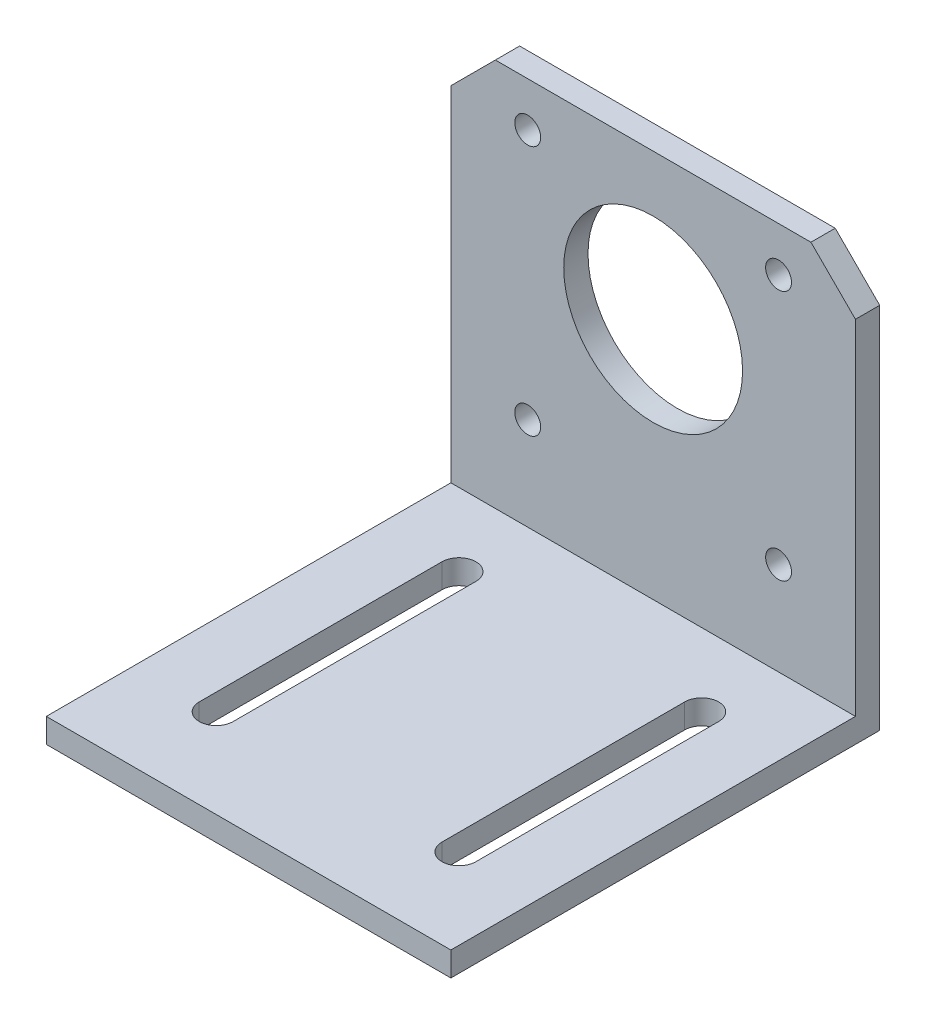
ISO-10303-21;
HEADER;
FILE_DESCRIPTION(('STEP AP214'),'2;1');
FILE_NAME('part.step','',(''),(''),'','','');
FILE_SCHEMA(('AUTOMOTIVE_DESIGN { 1 0 10303 214 1 1 1 1 }'));
ENDSEC;
DATA;
#1=APPLICATION_CONTEXT('core data for automotive mechanical design processes');
#2=APPLICATION_PROTOCOL_DEFINITION('international standard','automotive_design',2000,#1);
#3=PRODUCT_CONTEXT('',#1,'mechanical');
#4=PRODUCT('Part','Part','',(#3));
#5=PRODUCT_RELATED_PRODUCT_CATEGORY('part','',(#4));
#6=PRODUCT_DEFINITION_FORMATION('','',#4);
#7=PRODUCT_DEFINITION_CONTEXT('part definition',#1,'design');
#8=PRODUCT_DEFINITION('design','',#6,#7);
#9=PRODUCT_DEFINITION_SHAPE('','',#8);
#10=(LENGTH_UNIT() NAMED_UNIT(*) SI_UNIT(.MILLI.,.METRE.));
#11=(NAMED_UNIT(*) PLANE_ANGLE_UNIT() SI_UNIT($,.RADIAN.));
#12=(NAMED_UNIT(*) SI_UNIT($,.STERADIAN.) SOLID_ANGLE_UNIT());
#13=UNCERTAINTY_MEASURE_WITH_UNIT(LENGTH_MEASURE(1.E-05),#10,'distance_accuracy_value','');
#14=(GEOMETRIC_REPRESENTATION_CONTEXT(3) GLOBAL_UNCERTAINTY_ASSIGNED_CONTEXT((#13)) GLOBAL_UNIT_ASSIGNED_CONTEXT((#10,
#11,#12)) REPRESENTATION_CONTEXT('',''));
#15=CARTESIAN_POINT('',(0.,0.,0.));
#16=DIRECTION('',(0.,0.,1.));
#17=DIRECTION('',(1.,0.,0.));
#18=AXIS2_PLACEMENT_3D('',#15,#16,#17);
#19=CARTESIAN_POINT('',(50.,0.,0.));
#20=DIRECTION('',(0.,0.,-1.));
#21=DIRECTION('',(-1.,0.,0.));
#22=AXIS2_PLACEMENT_3D('',#19,#20,#21);
#23=PLANE('',#22);
#24=DIRECTION('',(0.,-1.,0.));
#25=VECTOR('',#24,1.);
#26=CARTESIAN_POINT('',(50.,0.,0.));
#27=LINE('',#26,#25);
#28=CARTESIAN_POINT('',(50.,3.,0.));
#29=VERTEX_POINT('',#28);
#30=CARTESIAN_POINT('',(50.,0.,0.));
#31=VERTEX_POINT('',#30);
#32=EDGE_CURVE('E189',#29,#31,#27,.T.);
#33=ORIENTED_EDGE('',*,*,#32,.F.);
#34=DIRECTION('',(-1.,0.,0.));
#35=VECTOR('',#34,1.);
#36=CARTESIAN_POINT('',(50.,3.,0.));
#37=LINE('',#36,#35);
#38=CARTESIAN_POINT('',(0.,3.,0.));
#39=VERTEX_POINT('',#38);
#40=EDGE_CURVE('E182',#29,#39,#37,.T.);
#41=ORIENTED_EDGE('',*,*,#40,.T.);
#42=DIRECTION('',(0.,-1.,0.));
#43=VECTOR('',#42,1.);
#44=CARTESIAN_POINT('',(0.,0.,0.));
#45=LINE('',#44,#43);
#46=CARTESIAN_POINT('',(0.,0.,0.));
#47=VERTEX_POINT('',#46);
#48=EDGE_CURVE('E200',#39,#47,#45,.T.);
#49=ORIENTED_EDGE('',*,*,#48,.T.);
#50=DIRECTION('',(-1.,0.,0.));
#51=VECTOR('',#50,1.);
#52=CARTESIAN_POINT('',(50.,0.,0.));
#53=LINE('',#52,#51);
#54=EDGE_CURVE('E215',#31,#47,#53,.T.);
#55=ORIENTED_EDGE('',*,*,#54,.F.);
#56=EDGE_LOOP('',(#33,#41,#49,#55));
#57=FACE_BOUND('',#56,.T.);
#58=ADVANCED_FACE('F42',(#57),#23,.F.);
#59=CARTESIAN_POINT('',(50.,0.,0.));
#60=DIRECTION('',(0.,1.,0.));
#61=DIRECTION('',(0.,0.,1.));
#62=AXIS2_PLACEMENT_3D('',#59,#60,#61);
#63=PLANE('',#62);
#64=DIRECTION('',(0.,0.,-1.));
#65=VECTOR('',#64,1.);
#66=CARTESIAN_POINT('',(12.1,0.,0.));
#67=LINE('',#66,#65);
#68=CARTESIAN_POINT('',(12.1,0.,-11.));
#69=VERTEX_POINT('',#68);
#70=CARTESIAN_POINT('',(12.1,0.,-41.));
#71=VERTEX_POINT('',#70);
#72=EDGE_CURVE('E316',#69,#71,#67,.T.);
#73=ORIENTED_EDGE('',*,*,#72,.T.);
#74=CARTESIAN_POINT('',(9.99999999999999,0.,-41.));
#75=DIRECTION('',(0.,1.,0.));
#76=DIRECTION('',(0.,0.,1.));
#77=AXIS2_PLACEMENT_3D('',#74,#75,#76);
#78=CIRCLE('',#77,2.1);
#79=CARTESIAN_POINT('',(7.89999999999999,0.,-41.));
#80=VERTEX_POINT('',#79);
#81=EDGE_CURVE('E261',#71,#80,#78,.T.);
#82=ORIENTED_EDGE('',*,*,#81,.T.);
#83=DIRECTION('',(0.,0.,1.));
#84=VECTOR('',#83,1.);
#85=CARTESIAN_POINT('',(7.9,0.,0.));
#86=LINE('',#85,#84);
#87=CARTESIAN_POINT('',(7.9,0.,-11.));
#88=VERTEX_POINT('',#87);
#89=EDGE_CURVE('E308',#80,#88,#86,.T.);
#90=ORIENTED_EDGE('',*,*,#89,.T.);
#91=CARTESIAN_POINT('',(10.,0.,-11.));
#92=DIRECTION('',(0.,1.,0.));
#93=DIRECTION('',(0.,0.,1.));
#94=AXIS2_PLACEMENT_3D('',#91,#92,#93);
#95=CIRCLE('',#94,2.1);
#96=EDGE_CURVE('E312',#88,#69,#95,.T.);
#97=ORIENTED_EDGE('',*,*,#96,.T.);
#98=EDGE_LOOP('',(#73,#82,#90,#97));
#99=FACE_BOUND('',#98,.T.);
#100=DIRECTION('',(0.,0.,-1.));
#101=VECTOR('',#100,1.);
#102=CARTESIAN_POINT('',(42.1,0.,0.));
#103=LINE('',#102,#101);
#104=CARTESIAN_POINT('',(42.1,0.,-11.));
#105=VERTEX_POINT('',#104);
#106=CARTESIAN_POINT('',(42.1,0.,-41.));
#107=VERTEX_POINT('',#106);
#108=EDGE_CURVE('E300',#105,#107,#103,.T.);
#109=ORIENTED_EDGE('',*,*,#108,.T.);
#110=CARTESIAN_POINT('',(40.,0.,-41.));
#111=DIRECTION('',(0.,1.,0.));
#112=DIRECTION('',(0.,0.,1.));
#113=AXIS2_PLACEMENT_3D('',#110,#111,#112);
#114=CIRCLE('',#113,2.1);
#115=CARTESIAN_POINT('',(37.9,0.,-41.));
#116=VERTEX_POINT('',#115);
#117=EDGE_CURVE('E304',#107,#116,#114,.T.);
#118=ORIENTED_EDGE('',*,*,#117,.T.);
#119=DIRECTION('',(0.,0.,1.));
#120=VECTOR('',#119,1.);
#121=CARTESIAN_POINT('',(37.9,0.,0.));
#122=LINE('',#121,#120);
#123=CARTESIAN_POINT('',(37.9,0.,-11.));
#124=VERTEX_POINT('',#123);
#125=EDGE_CURVE('E263',#116,#124,#122,.T.);
#126=ORIENTED_EDGE('',*,*,#125,.T.);
#127=CARTESIAN_POINT('',(40.,0.,-11.));
#128=DIRECTION('',(0.,1.,0.));
#129=DIRECTION('',(0.,0.,1.));
#130=AXIS2_PLACEMENT_3D('',#127,#128,#129);
#131=CIRCLE('',#130,2.1);
#132=EDGE_CURVE('E268',#124,#105,#131,.T.);
#133=ORIENTED_EDGE('',*,*,#132,.T.);
#134=EDGE_LOOP('',(#109,#118,#126,#133));
#135=FACE_BOUND('',#134,.T.);
#136=DIRECTION('',(0.,0.,-1.));
#137=VECTOR('',#136,1.);
#138=CARTESIAN_POINT('',(0.,0.,0.));
#139=LINE('',#138,#137);
#140=CARTESIAN_POINT('',(0.,0.,-53.));
#141=VERTEX_POINT('',#140);
#142=EDGE_CURVE('E203',#47,#141,#139,.T.);
#143=ORIENTED_EDGE('',*,*,#142,.T.);
#144=DIRECTION('',(-1.,0.,0.));
#145=VECTOR('',#144,1.);
#146=CARTESIAN_POINT('',(50.,0.,-53.));
#147=LINE('',#146,#145);
#148=CARTESIAN_POINT('',(50.,0.,-53.));
#149=VERTEX_POINT('',#148);
#150=EDGE_CURVE('E211',#149,#141,#147,.T.);
#151=ORIENTED_EDGE('',*,*,#150,.F.);
#152=DIRECTION('',(0.,0.,-1.));
#153=VECTOR('',#152,1.);
#154=CARTESIAN_POINT('',(50.,0.,0.));
#155=LINE('',#154,#153);
#156=EDGE_CURVE('E192',#31,#149,#155,.T.);
#157=ORIENTED_EDGE('',*,*,#156,.F.);
#158=ORIENTED_EDGE('',*,*,#54,.T.);
#159=EDGE_LOOP('',(#143,#151,#157,#158));
#160=FACE_BOUND('',#159,.T.);
#161=ADVANCED_FACE('F344',(#99,#135,#160),#63,.F.);
#162=CARTESIAN_POINT('',(50.,0.,-53.));
#163=DIRECTION('',(0.,0.,1.));
#164=DIRECTION('',(1.,0.,0.));
#165=AXIS2_PLACEMENT_3D('',#162,#163,#164);
#166=PLANE('',#165);
#167=CARTESIAN_POINT('',(40.5,45.5,-53.));
#168=DIRECTION('',(0.,0.,1.));
#169=DIRECTION('',(1.,0.,0.));
#170=AXIS2_PLACEMENT_3D('',#167,#168,#169);
#171=CIRCLE('',#170,1.6);
#172=CARTESIAN_POINT('',(42.1,45.5,-53.));
#173=VERTEX_POINT('',#172);
#174=EDGE_CURVE('E273',#173,#173,#171,.T.);
#175=ORIENTED_EDGE('',*,*,#174,.T.);
#176=EDGE_LOOP('',(#175));
#177=FACE_BOUND('',#176,.T.);
#178=CARTESIAN_POINT('',(9.5,45.5,-53.));
#179=DIRECTION('',(0.,0.,1.));
#180=DIRECTION('',(1.,0.,0.));
#181=AXIS2_PLACEMENT_3D('',#178,#179,#180);
#182=CIRCLE('',#181,1.6);
#183=CARTESIAN_POINT('',(11.1,45.5,-53.));
#184=VERTEX_POINT('',#183);
#185=EDGE_CURVE('E375',#184,#184,#182,.T.);
#186=ORIENTED_EDGE('',*,*,#185,.T.);
#187=EDGE_LOOP('',(#186));
#188=FACE_BOUND('',#187,.T.);
#189=CARTESIAN_POINT('',(9.5,14.5,-53.));
#190=DIRECTION('',(0.,0.,1.));
#191=DIRECTION('',(1.,0.,0.));
#192=AXIS2_PLACEMENT_3D('',#189,#190,#191);
#193=CIRCLE('',#192,1.6);
#194=CARTESIAN_POINT('',(11.1,14.5,-53.));
#195=VERTEX_POINT('',#194);
#196=EDGE_CURVE('E372',#195,#195,#193,.T.);
#197=ORIENTED_EDGE('',*,*,#196,.T.);
#198=EDGE_LOOP('',(#197));
#199=FACE_BOUND('',#198,.T.);
#200=CARTESIAN_POINT('',(40.5,14.5,-53.));
#201=DIRECTION('',(0.,0.,1.));
#202=DIRECTION('',(1.,0.,0.));
#203=AXIS2_PLACEMENT_3D('',#200,#201,#202);
#204=CIRCLE('',#203,1.6);
#205=CARTESIAN_POINT('',(42.1,14.5,-53.));
#206=VERTEX_POINT('',#205);
#207=EDGE_CURVE('E362',#206,#206,#204,.T.);
#208=ORIENTED_EDGE('',*,*,#207,.T.);
#209=EDGE_LOOP('',(#208));
#210=FACE_BOUND('',#209,.T.);
#211=CARTESIAN_POINT('',(25.,33.,-53.));
#212=DIRECTION('',(0.,0.,1.));
#213=DIRECTION('',(1.,0.,0.));
#214=AXIS2_PLACEMENT_3D('',#211,#212,#213);
#215=CIRCLE('',#214,11.05);
#216=CARTESIAN_POINT('',(36.05,33.,-53.));
#217=VERTEX_POINT('',#216);
#218=EDGE_CURVE('E358',#217,#217,#215,.T.);
#219=ORIENTED_EDGE('',*,*,#218,.T.);
#220=EDGE_LOOP('',(#219));
#221=FACE_BOUND('',#220,.T.);
#222=DIRECTION('',(0.,1.,0.));
#223=VECTOR('',#222,1.);
#224=CARTESIAN_POINT('',(0.,0.,-53.));
#225=LINE('',#224,#223);
#226=CARTESIAN_POINT('',(0.,45.5,-53.));
#227=VERTEX_POINT('',#226);
#228=EDGE_CURVE('E193',#141,#227,#225,.T.);
#229=ORIENTED_EDGE('',*,*,#228,.T.);
#230=DIRECTION('',(0.707106781186548,0.707106781186547,0.));
#231=VECTOR('',#230,1.);
#232=CARTESIAN_POINT('',(2.25000000000002,47.75,-53.));
#233=LINE('',#232,#231);
#234=CARTESIAN_POINT('',(5.5,51.,-53.));
#235=VERTEX_POINT('',#234);
#236=EDGE_CURVE('E354',#227,#235,#233,.T.);
#237=ORIENTED_EDGE('',*,*,#236,.T.);
#238=DIRECTION('',(-1.,0.,0.));
#239=VECTOR('',#238,1.);
#240=CARTESIAN_POINT('',(50.,51.,-53.));
#241=LINE('',#240,#239);
#242=CARTESIAN_POINT('',(44.5,51.,-53.));
#243=VERTEX_POINT('',#242);
#244=EDGE_CURVE('E169',#243,#235,#241,.T.);
#245=ORIENTED_EDGE('',*,*,#244,.F.);
#246=DIRECTION('',(0.707106781186548,-0.707106781186548,0.));
#247=VECTOR('',#246,1.);
#248=CARTESIAN_POINT('',(72.75,22.75,-53.));
#249=LINE('',#248,#247);
#250=CARTESIAN_POINT('',(50.,45.5,-53.));
#251=VERTEX_POINT('',#250);
#252=EDGE_CURVE('E356',#243,#251,#249,.T.);
#253=ORIENTED_EDGE('',*,*,#252,.T.);
#254=DIRECTION('',(0.,1.,0.));
#255=VECTOR('',#254,1.);
#256=CARTESIAN_POINT('',(50.,0.,-53.));
#257=LINE('',#256,#255);
#258=EDGE_CURVE('E196',#149,#251,#257,.T.);
#259=ORIENTED_EDGE('',*,*,#258,.F.);
#260=ORIENTED_EDGE('',*,*,#150,.T.);
#261=EDGE_LOOP('',(#229,#237,#245,#253,#259,#260));
#262=FACE_BOUND('',#261,.T.);
#263=ADVANCED_FACE('F353',(#177,#188,#199,#210,#221,#262),#166,.F.);
#264=CARTESIAN_POINT('',(50.,51.,0.));
#265=DIRECTION('',(0.,-1.,0.));
#266=DIRECTION('',(0.,0.,-1.));
#267=AXIS2_PLACEMENT_3D('',#264,#265,#266);
#268=PLANE('',#267);
#269=ORIENTED_EDGE('',*,*,#244,.T.);
#270=DIRECTION('',(0.,0.,1.));
#271=VECTOR('',#270,1.);
#272=CARTESIAN_POINT('',(5.5,51.,-100.));
#273=LINE('',#272,#271);
#274=CARTESIAN_POINT('',(5.5,51.,-50.));
#275=VERTEX_POINT('',#274);
#276=EDGE_CURVE('E155',#235,#275,#273,.T.);
#277=ORIENTED_EDGE('',*,*,#276,.T.);
#278=DIRECTION('',(-1.,0.,0.));
#279=VECTOR('',#278,1.);
#280=CARTESIAN_POINT('',(50.,51.,-50.));
#281=LINE('',#280,#279);
#282=CARTESIAN_POINT('',(44.5,51.,-50.));
#283=VERTEX_POINT('',#282);
#284=EDGE_CURVE('E167',#283,#275,#281,.T.);
#285=ORIENTED_EDGE('',*,*,#284,.F.);
#286=DIRECTION('',(0.,0.,1.));
#287=VECTOR('',#286,1.);
#288=CARTESIAN_POINT('',(44.5,51.,-100.));
#289=LINE('',#288,#287);
#290=EDGE_CURVE('E57',#243,#283,#289,.T.);
#291=ORIENTED_EDGE('',*,*,#290,.F.);
#292=EDGE_LOOP('',(#269,#277,#285,#291));
#293=FACE_BOUND('',#292,.T.);
#294=ADVANCED_FACE('F166',(#293),#268,.F.);
#295=CARTESIAN_POINT('',(50.,0.,0.));
#296=DIRECTION('',(-1.,0.,0.));
#297=DIRECTION('',(0.,0.,1.));
#298=AXIS2_PLACEMENT_3D('',#295,#296,#297);
#299=PLANE('',#298);
#300=ORIENTED_EDGE('',*,*,#258,.T.);
#301=DIRECTION('',(0.,0.,1.));
#302=VECTOR('',#301,1.);
#303=CARTESIAN_POINT('',(50.,45.5,-100.));
#304=LINE('',#303,#302);
#305=CARTESIAN_POINT('',(50.,45.5,-50.));
#306=VERTEX_POINT('',#305);
#307=EDGE_CURVE('E493',#251,#306,#304,.T.);
#308=ORIENTED_EDGE('',*,*,#307,.T.);
#309=DIRECTION('',(0.,-1.,0.));
#310=VECTOR('',#309,1.);
#311=CARTESIAN_POINT('',(50.,51.,-50.));
#312=LINE('',#311,#310);
#313=CARTESIAN_POINT('',(50.,3.,-50.));
#314=VERTEX_POINT('',#313);
#315=EDGE_CURVE('E185',#306,#314,#312,.T.);
#316=ORIENTED_EDGE('',*,*,#315,.T.);
#317=DIRECTION('',(0.,0.,1.));
#318=VECTOR('',#317,1.);
#319=CARTESIAN_POINT('',(50.,3.,-50.));
#320=LINE('',#319,#318);
#321=EDGE_CURVE('E177',#314,#29,#320,.T.);
#322=ORIENTED_EDGE('',*,*,#321,.T.);
#323=ORIENTED_EDGE('',*,*,#32,.T.);
#324=ORIENTED_EDGE('',*,*,#156,.T.);
#325=EDGE_LOOP('',(#300,#308,#316,#322,#323,#324));
#326=FACE_BOUND('',#325,.T.);
#327=ADVANCED_FACE('F347',(#326),#299,.F.);
#328=CARTESIAN_POINT('',(0.,0.,0.));
#329=DIRECTION('',(-1.,0.,0.));
#330=DIRECTION('',(0.,0.,1.));
#331=AXIS2_PLACEMENT_3D('',#328,#329,#330);
#332=PLANE('',#331);
#333=DIRECTION('',(0.,0.,1.));
#334=VECTOR('',#333,1.);
#335=CARTESIAN_POINT('',(0.,45.5,-100.));
#336=LINE('',#335,#334);
#337=CARTESIAN_POINT('',(0.,45.5,-50.));
#338=VERTEX_POINT('',#337);
#339=EDGE_CURVE('E65',#227,#338,#336,.T.);
#340=ORIENTED_EDGE('',*,*,#339,.F.);
#341=ORIENTED_EDGE('',*,*,#228,.F.);
#342=ORIENTED_EDGE('',*,*,#142,.F.);
#343=ORIENTED_EDGE('',*,*,#48,.F.);
#344=DIRECTION('',(0.,0.,1.));
#345=VECTOR('',#344,1.);
#346=CARTESIAN_POINT('',(0.,3.,-50.));
#347=LINE('',#346,#345);
#348=CARTESIAN_POINT('',(0.,3.,-50.));
#349=VERTEX_POINT('',#348);
#350=EDGE_CURVE('E323',#349,#39,#347,.T.);
#351=ORIENTED_EDGE('',*,*,#350,.F.);
#352=DIRECTION('',(0.,-1.,0.));
#353=VECTOR('',#352,1.);
#354=CARTESIAN_POINT('',(0.,51.,-50.));
#355=LINE('',#354,#353);
#356=EDGE_CURVE('E321',#338,#349,#355,.T.);
#357=ORIENTED_EDGE('',*,*,#356,.F.);
#358=EDGE_LOOP('',(#340,#341,#342,#343,#351,#357));
#359=FACE_BOUND('',#358,.T.);
#360=ADVANCED_FACE('F339',(#359),#332,.T.);
#361=CARTESIAN_POINT('',(50.,3.,-50.));
#362=DIRECTION('',(0.,-1.,0.));
#363=DIRECTION('',(0.,0.,-1.));
#364=AXIS2_PLACEMENT_3D('',#361,#362,#363);
#365=PLANE('',#364);
#366=DIRECTION('',(0.,0.,-1.));
#367=VECTOR('',#366,1.);
#368=CARTESIAN_POINT('',(7.89999999999999,3.,-50.));
#369=LINE('',#368,#367);
#370=CARTESIAN_POINT('',(7.9,3.,-11.));
#371=VERTEX_POINT('',#370);
#372=CARTESIAN_POINT('',(7.89999999999999,3.,-41.));
#373=VERTEX_POINT('',#372);
#374=EDGE_CURVE('E235',#371,#373,#369,.T.);
#375=ORIENTED_EDGE('',*,*,#374,.T.);
#376=CARTESIAN_POINT('',(9.99999999999999,3.,-41.));
#377=DIRECTION('',(0.,-1.,0.));
#378=DIRECTION('',(0.,0.,-1.));
#379=AXIS2_PLACEMENT_3D('',#376,#377,#378);
#380=CIRCLE('',#379,2.1);
#381=CARTESIAN_POINT('',(12.1,3.,-41.));
#382=VERTEX_POINT('',#381);
#383=EDGE_CURVE('E11',#373,#382,#380,.T.);
#384=ORIENTED_EDGE('',*,*,#383,.T.);
#385=DIRECTION('',(0.,0.,1.));
#386=VECTOR('',#385,1.);
#387=CARTESIAN_POINT('',(12.1,3.,-50.));
#388=LINE('',#387,#386);
#389=CARTESIAN_POINT('',(12.1,3.,-11.));
#390=VERTEX_POINT('',#389);
#391=EDGE_CURVE('E50',#382,#390,#388,.T.);
#392=ORIENTED_EDGE('',*,*,#391,.T.);
#393=CARTESIAN_POINT('',(10.,3.,-11.));
#394=DIRECTION('',(0.,-1.,0.));
#395=DIRECTION('',(0.,0.,-1.));
#396=AXIS2_PLACEMENT_3D('',#393,#394,#395);
#397=CIRCLE('',#396,2.1);
#398=EDGE_CURVE('E239',#390,#371,#397,.T.);
#399=ORIENTED_EDGE('',*,*,#398,.T.);
#400=EDGE_LOOP('',(#375,#384,#392,#399));
#401=FACE_BOUND('',#400,.T.);
#402=DIRECTION('',(0.,0.,-1.));
#403=VECTOR('',#402,1.);
#404=CARTESIAN_POINT('',(37.9,3.,-50.));
#405=LINE('',#404,#403);
#406=CARTESIAN_POINT('',(37.9,3.,-11.));
#407=VERTEX_POINT('',#406);
#408=CARTESIAN_POINT('',(37.9,3.,-41.));
#409=VERTEX_POINT('',#408);
#410=EDGE_CURVE('E219',#407,#409,#405,.T.);
#411=ORIENTED_EDGE('',*,*,#410,.T.);
#412=CARTESIAN_POINT('',(40.,3.,-41.));
#413=DIRECTION('',(0.,-1.,0.));
#414=DIRECTION('',(0.,0.,-1.));
#415=AXIS2_PLACEMENT_3D('',#412,#413,#414);
#416=CIRCLE('',#415,2.1);
#417=CARTESIAN_POINT('',(42.1,3.,-41.));
#418=VERTEX_POINT('',#417);
#419=EDGE_CURVE('E231',#409,#418,#416,.T.);
#420=ORIENTED_EDGE('',*,*,#419,.T.);
#421=DIRECTION('',(0.,0.,1.));
#422=VECTOR('',#421,1.);
#423=CARTESIAN_POINT('',(42.1,3.,-50.));
#424=LINE('',#423,#422);
#425=CARTESIAN_POINT('',(42.1,3.,-11.));
#426=VERTEX_POINT('',#425);
#427=EDGE_CURVE('E227',#418,#426,#424,.T.);
#428=ORIENTED_EDGE('',*,*,#427,.T.);
#429=CARTESIAN_POINT('',(40.,3.,-11.));
#430=DIRECTION('',(0.,-1.,0.));
#431=DIRECTION('',(0.,0.,-1.));
#432=AXIS2_PLACEMENT_3D('',#429,#430,#431);
#433=CIRCLE('',#432,2.1);
#434=EDGE_CURVE('E223',#426,#407,#433,.T.);
#435=ORIENTED_EDGE('',*,*,#434,.T.);
#436=EDGE_LOOP('',(#411,#420,#428,#435));
#437=FACE_BOUND('',#436,.T.);
#438=ORIENTED_EDGE('',*,*,#350,.T.);
#439=ORIENTED_EDGE('',*,*,#40,.F.);
#440=ORIENTED_EDGE('',*,*,#321,.F.);
#441=DIRECTION('',(-1.,0.,0.));
#442=VECTOR('',#441,1.);
#443=CARTESIAN_POINT('',(50.,3.,-50.));
#444=LINE('',#443,#442);
#445=EDGE_CURVE('E176',#314,#349,#444,.T.);
#446=ORIENTED_EDGE('',*,*,#445,.T.);
#447=EDGE_LOOP('',(#438,#439,#440,#446));
#448=FACE_BOUND('',#447,.T.);
#449=ADVANCED_FACE('F245',(#401,#437,#448),#365,.F.);
#450=CARTESIAN_POINT('',(50.,51.,-50.));
#451=DIRECTION('',(0.,0.,-1.));
#452=DIRECTION('',(0.,1.,0.));
#453=AXIS2_PLACEMENT_3D('',#450,#451,#452);
#454=PLANE('',#453);
#455=CARTESIAN_POINT('',(40.5,45.5,-50.));
#456=DIRECTION('',(0.,0.,1.));
#457=DIRECTION('',(1.,0.,0.));
#458=AXIS2_PLACEMENT_3D('',#455,#456,#457);
#459=CIRCLE('',#458,1.6);
#460=CARTESIAN_POINT('',(42.1,45.5,-50.));
#461=VERTEX_POINT('',#460);
#462=EDGE_CURVE('E480',#461,#461,#459,.T.);
#463=ORIENTED_EDGE('',*,*,#462,.F.);
#464=EDGE_LOOP('',(#463));
#465=FACE_BOUND('',#464,.T.);
#466=CARTESIAN_POINT('',(9.5,45.5,-50.));
#467=DIRECTION('',(0.,0.,1.));
#468=DIRECTION('',(1.,0.,0.));
#469=AXIS2_PLACEMENT_3D('',#466,#467,#468);
#470=CIRCLE('',#469,1.6);
#471=CARTESIAN_POINT('',(11.1,45.5,-50.));
#472=VERTEX_POINT('',#471);
#473=EDGE_CURVE('E475',#472,#472,#470,.T.);
#474=ORIENTED_EDGE('',*,*,#473,.F.);
#475=EDGE_LOOP('',(#474));
#476=FACE_BOUND('',#475,.T.);
#477=CARTESIAN_POINT('',(9.5,14.5,-50.));
#478=DIRECTION('',(0.,0.,1.));
#479=DIRECTION('',(1.,0.,0.));
#480=AXIS2_PLACEMENT_3D('',#477,#478,#479);
#481=CIRCLE('',#480,1.6);
#482=CARTESIAN_POINT('',(11.1,14.5,-50.));
#483=VERTEX_POINT('',#482);
#484=EDGE_CURVE('E464',#483,#483,#481,.T.);
#485=ORIENTED_EDGE('',*,*,#484,.F.);
#486=EDGE_LOOP('',(#485));
#487=FACE_BOUND('',#486,.T.);
#488=CARTESIAN_POINT('',(40.5,14.5,-50.));
#489=DIRECTION('',(0.,0.,1.));
#490=DIRECTION('',(1.,0.,0.));
#491=AXIS2_PLACEMENT_3D('',#488,#489,#490);
#492=CIRCLE('',#491,1.6);
#493=CARTESIAN_POINT('',(42.1,14.5,-50.));
#494=VERTEX_POINT('',#493);
#495=EDGE_CURVE('E161',#494,#494,#492,.T.);
#496=ORIENTED_EDGE('',*,*,#495,.F.);
#497=EDGE_LOOP('',(#496));
#498=FACE_BOUND('',#497,.T.);
#499=CARTESIAN_POINT('',(25.,33.,-50.));
#500=DIRECTION('',(0.,0.,1.));
#501=DIRECTION('',(1.,0.,0.));
#502=AXIS2_PLACEMENT_3D('',#499,#500,#501);
#503=CIRCLE('',#502,11.05);
#504=CARTESIAN_POINT('',(36.05,33.,-50.));
#505=VERTEX_POINT('',#504);
#506=EDGE_CURVE('E365',#505,#505,#503,.T.);
#507=ORIENTED_EDGE('',*,*,#506,.F.);
#508=EDGE_LOOP('',(#507));
#509=FACE_BOUND('',#508,.T.);
#510=ORIENTED_EDGE('',*,*,#284,.T.);
#511=DIRECTION('',(0.707106781186548,0.707106781186547,0.));
#512=VECTOR('',#511,1.);
#513=CARTESIAN_POINT('',(5.5,51.,-50.));
#514=LINE('',#513,#512);
#515=EDGE_CURVE('E152',#338,#275,#514,.T.);
#516=ORIENTED_EDGE('',*,*,#515,.F.);
#517=ORIENTED_EDGE('',*,*,#356,.T.);
#518=ORIENTED_EDGE('',*,*,#445,.F.);
#519=ORIENTED_EDGE('',*,*,#315,.F.);
#520=DIRECTION('',(0.707106781186547,-0.707106781186547,0.));
#521=VECTOR('',#520,1.);
#522=CARTESIAN_POINT('',(44.5,51.,-50.));
#523=LINE('',#522,#521);
#524=EDGE_CURVE('E171',#283,#306,#523,.T.);
#525=ORIENTED_EDGE('',*,*,#524,.F.);
#526=EDGE_LOOP('',(#510,#516,#517,#518,#519,#525));
#527=FACE_BOUND('',#526,.T.);
#528=ADVANCED_FACE('F173',(#465,#476,#487,#498,#509,#527),#454,.F.);
#529=CARTESIAN_POINT('',(40.,-22.,-41.));
#530=DIRECTION('',(0.,1.,0.));
#531=DIRECTION('',(0.,0.,1.));
#532=AXIS2_PLACEMENT_3D('',#529,#530,#531);
#533=CYLINDRICAL_SURFACE('',#532,2.1);
#534=DIRECTION('',(0.,1.,0.));
#535=VECTOR('',#534,1.);
#536=CARTESIAN_POINT('',(42.1,-22.,-41.));
#537=LINE('',#536,#535);
#538=EDGE_CURVE('E293',#107,#418,#537,.T.);
#539=ORIENTED_EDGE('',*,*,#538,.T.);
#540=ORIENTED_EDGE('',*,*,#419,.F.);
#541=DIRECTION('',(0.,1.,0.));
#542=VECTOR('',#541,1.);
#543=CARTESIAN_POINT('',(37.9,-22.,-41.));
#544=LINE('',#543,#542);
#545=EDGE_CURVE('E282',#116,#409,#544,.T.);
#546=ORIENTED_EDGE('',*,*,#545,.F.);
#547=ORIENTED_EDGE('',*,*,#117,.F.);
#548=EDGE_LOOP('',(#539,#540,#546,#547));
#549=FACE_BOUND('',#548,.T.);
#550=ADVANCED_FACE('F417',(#549),#533,.F.);
#551=CARTESIAN_POINT('',(42.1,-22.,-41.));
#552=DIRECTION('',(1.,0.,0.));
#553=DIRECTION('',(0.,0.,-1.));
#554=AXIS2_PLACEMENT_3D('',#551,#552,#553);
#555=PLANE('',#554);
#556=DIRECTION('',(0.,1.,0.));
#557=VECTOR('',#556,1.);
#558=CARTESIAN_POINT('',(42.1,-22.,-11.));
#559=LINE('',#558,#557);
#560=EDGE_CURVE('E289',#105,#426,#559,.T.);
#561=ORIENTED_EDGE('',*,*,#560,.T.);
#562=ORIENTED_EDGE('',*,*,#427,.F.);
#563=ORIENTED_EDGE('',*,*,#538,.F.);
#564=ORIENTED_EDGE('',*,*,#108,.F.);
#565=EDGE_LOOP('',(#561,#562,#563,#564));
#566=FACE_BOUND('',#565,.T.);
#567=ADVANCED_FACE('F421',(#566),#555,.F.);
#568=CARTESIAN_POINT('',(40.,-22.,-11.));
#569=DIRECTION('',(0.,1.,0.));
#570=DIRECTION('',(0.,0.,1.));
#571=AXIS2_PLACEMENT_3D('',#568,#569,#570);
#572=CYLINDRICAL_SURFACE('',#571,2.1);
#573=DIRECTION('',(0.,1.,0.));
#574=VECTOR('',#573,1.);
#575=CARTESIAN_POINT('',(37.9,-22.,-11.));
#576=LINE('',#575,#574);
#577=EDGE_CURVE('E285',#124,#407,#576,.T.);
#578=ORIENTED_EDGE('',*,*,#577,.T.);
#579=ORIENTED_EDGE('',*,*,#434,.F.);
#580=ORIENTED_EDGE('',*,*,#560,.F.);
#581=ORIENTED_EDGE('',*,*,#132,.F.);
#582=EDGE_LOOP('',(#578,#579,#580,#581));
#583=FACE_BOUND('',#582,.T.);
#584=ADVANCED_FACE('F424',(#583),#572,.F.);
#585=CARTESIAN_POINT('',(37.9,-22.,-41.));
#586=DIRECTION('',(-1.,0.,0.));
#587=DIRECTION('',(0.,0.,1.));
#588=AXIS2_PLACEMENT_3D('',#585,#586,#587);
#589=PLANE('',#588);
#590=ORIENTED_EDGE('',*,*,#545,.T.);
#591=ORIENTED_EDGE('',*,*,#410,.F.);
#592=ORIENTED_EDGE('',*,*,#577,.F.);
#593=ORIENTED_EDGE('',*,*,#125,.F.);
#594=EDGE_LOOP('',(#590,#591,#592,#593));
#595=FACE_BOUND('',#594,.T.);
#596=ADVANCED_FACE('F428',(#595),#589,.F.);
#597=CARTESIAN_POINT('',(9.99999999999999,-22.,-41.));
#598=DIRECTION('',(0.,1.,0.));
#599=DIRECTION('',(0.,0.,1.));
#600=AXIS2_PLACEMENT_3D('',#597,#598,#599);
#601=CYLINDRICAL_SURFACE('',#600,2.1);
#602=DIRECTION('',(0.,1.,0.));
#603=VECTOR('',#602,1.);
#604=CARTESIAN_POINT('',(12.1,-22.,-41.));
#605=LINE('',#604,#603);
#606=EDGE_CURVE('E253',#71,#382,#605,.T.);
#607=ORIENTED_EDGE('',*,*,#606,.T.);
#608=ORIENTED_EDGE('',*,*,#383,.F.);
#609=DIRECTION('',(0.,1.,0.));
#610=VECTOR('',#609,1.);
#611=CARTESIAN_POINT('',(7.89999999999999,-22.,-41.));
#612=LINE('',#611,#610);
#613=EDGE_CURVE('E279',#80,#373,#612,.T.);
#614=ORIENTED_EDGE('',*,*,#613,.F.);
#615=ORIENTED_EDGE('',*,*,#81,.F.);
#616=EDGE_LOOP('',(#607,#608,#614,#615));
#617=FACE_BOUND('',#616,.T.);
#618=ADVANCED_FACE('F258',(#617),#601,.F.);
#619=CARTESIAN_POINT('',(12.1,-22.,-41.));
#620=DIRECTION('',(1.,0.,0.));
#621=DIRECTION('',(0.,0.,-1.));
#622=AXIS2_PLACEMENT_3D('',#619,#620,#621);
#623=PLANE('',#622);
#624=DIRECTION('',(0.,1.,0.));
#625=VECTOR('',#624,1.);
#626=CARTESIAN_POINT('',(12.1,-22.,-11.));
#627=LINE('',#626,#625);
#628=EDGE_CURVE('E256',#69,#390,#627,.T.);
#629=ORIENTED_EDGE('',*,*,#628,.T.);
#630=ORIENTED_EDGE('',*,*,#391,.F.);
#631=ORIENTED_EDGE('',*,*,#606,.F.);
#632=ORIENTED_EDGE('',*,*,#72,.F.);
#633=EDGE_LOOP('',(#629,#630,#631,#632));
#634=FACE_BOUND('',#633,.T.);
#635=ADVANCED_FACE('F252',(#634),#623,.F.);
#636=CARTESIAN_POINT('',(10.,-22.,-11.));
#637=DIRECTION('',(0.,1.,0.));
#638=DIRECTION('',(0.,0.,1.));
#639=AXIS2_PLACEMENT_3D('',#636,#637,#638);
#640=CYLINDRICAL_SURFACE('',#639,2.1);
#641=DIRECTION('',(0.,1.,0.));
#642=VECTOR('',#641,1.);
#643=CARTESIAN_POINT('',(7.9,-22.,-11.));
#644=LINE('',#643,#642);
#645=EDGE_CURVE('E270',#88,#371,#644,.T.);
#646=ORIENTED_EDGE('',*,*,#645,.T.);
#647=ORIENTED_EDGE('',*,*,#398,.F.);
#648=ORIENTED_EDGE('',*,*,#628,.F.);
#649=ORIENTED_EDGE('',*,*,#96,.F.);
#650=EDGE_LOOP('',(#646,#647,#648,#649));
#651=FACE_BOUND('',#650,.T.);
#652=ADVANCED_FACE('F442',(#651),#640,.F.);
#653=CARTESIAN_POINT('',(7.89999999999999,-22.,-41.));
#654=DIRECTION('',(-1.,0.,0.));
#655=DIRECTION('',(0.,0.,1.));
#656=AXIS2_PLACEMENT_3D('',#653,#654,#655);
#657=PLANE('',#656);
#658=ORIENTED_EDGE('',*,*,#613,.T.);
#659=ORIENTED_EDGE('',*,*,#374,.F.);
#660=ORIENTED_EDGE('',*,*,#645,.F.);
#661=ORIENTED_EDGE('',*,*,#89,.F.);
#662=EDGE_LOOP('',(#658,#659,#660,#661));
#663=FACE_BOUND('',#662,.T.);
#664=ADVANCED_FACE('F438',(#663),#657,.F.);
#665=CARTESIAN_POINT('',(25.,33.,-100.));
#666=DIRECTION('',(0.,0.,1.));
#667=DIRECTION('',(1.,0.,0.));
#668=AXIS2_PLACEMENT_3D('',#665,#666,#667);
#669=CYLINDRICAL_SURFACE('',#668,11.05);
#670=ORIENTED_EDGE('',*,*,#506,.T.);
#671=EDGE_LOOP('',(#670));
#672=FACE_BOUND('',#671,.T.);
#673=ORIENTED_EDGE('',*,*,#218,.F.);
#674=EDGE_LOOP('',(#673));
#675=FACE_BOUND('',#674,.T.);
#676=ADVANCED_FACE('F441',(#672,#675),#669,.F.);
#677=CARTESIAN_POINT('',(44.5,51.,-100.));
#678=DIRECTION('',(-0.707106781186547,-0.707106781186547,0.));
#679=DIRECTION('',(0.707106781186548,-0.707106781186548,0.));
#680=AXIS2_PLACEMENT_3D('',#677,#678,#679);
#681=PLANE('',#680);
#682=ORIENTED_EDGE('',*,*,#290,.T.);
#683=ORIENTED_EDGE('',*,*,#524,.T.);
#684=ORIENTED_EDGE('',*,*,#307,.F.);
#685=ORIENTED_EDGE('',*,*,#252,.F.);
#686=EDGE_LOOP('',(#682,#683,#684,#685));
#687=FACE_BOUND('',#686,.T.);
#688=ADVANCED_FACE('F451',(#687),#681,.F.);
#689=CARTESIAN_POINT('',(5.5,51.,-100.));
#690=DIRECTION('',(0.707106781186547,-0.707106781186548,0.));
#691=DIRECTION('',(0.707106781186548,0.707106781186547,0.));
#692=AXIS2_PLACEMENT_3D('',#689,#690,#691);
#693=PLANE('',#692);
#694=ORIENTED_EDGE('',*,*,#339,.T.);
#695=ORIENTED_EDGE('',*,*,#515,.T.);
#696=ORIENTED_EDGE('',*,*,#276,.F.);
#697=ORIENTED_EDGE('',*,*,#236,.F.);
#698=EDGE_LOOP('',(#694,#695,#696,#697));
#699=FACE_BOUND('',#698,.T.);
#700=ADVANCED_FACE('F154',(#699),#693,.F.);
#701=CARTESIAN_POINT('',(40.5,14.5,-100.));
#702=DIRECTION('',(0.,0.,1.));
#703=DIRECTION('',(1.,0.,0.));
#704=AXIS2_PLACEMENT_3D('',#701,#702,#703);
#705=CYLINDRICAL_SURFACE('',#704,1.6);
#706=ORIENTED_EDGE('',*,*,#495,.T.);
#707=EDGE_LOOP('',(#706));
#708=FACE_BOUND('',#707,.T.);
#709=ORIENTED_EDGE('',*,*,#207,.F.);
#710=EDGE_LOOP('',(#709));
#711=FACE_BOUND('',#710,.T.);
#712=ADVANCED_FACE('F453',(#708,#711),#705,.F.);
#713=CARTESIAN_POINT('',(9.5,14.5,-100.));
#714=DIRECTION('',(0.,0.,1.));
#715=DIRECTION('',(1.,0.,0.));
#716=AXIS2_PLACEMENT_3D('',#713,#714,#715);
#717=CYLINDRICAL_SURFACE('',#716,1.6);
#718=ORIENTED_EDGE('',*,*,#484,.T.);
#719=EDGE_LOOP('',(#718));
#720=FACE_BOUND('',#719,.T.);
#721=ORIENTED_EDGE('',*,*,#196,.F.);
#722=EDGE_LOOP('',(#721));
#723=FACE_BOUND('',#722,.T.);
#724=ADVANCED_FACE('F393',(#720,#723),#717,.F.);
#725=CARTESIAN_POINT('',(9.5,45.5,-100.));
#726=DIRECTION('',(0.,0.,1.));
#727=DIRECTION('',(1.,0.,0.));
#728=AXIS2_PLACEMENT_3D('',#725,#726,#727);
#729=CYLINDRICAL_SURFACE('',#728,1.6);
#730=ORIENTED_EDGE('',*,*,#473,.T.);
#731=EDGE_LOOP('',(#730));
#732=FACE_BOUND('',#731,.T.);
#733=ORIENTED_EDGE('',*,*,#185,.F.);
#734=EDGE_LOOP('',(#733));
#735=FACE_BOUND('',#734,.T.);
#736=ADVANCED_FACE('F387',(#732,#735),#729,.F.);
#737=CARTESIAN_POINT('',(40.5,45.5,-100.));
#738=DIRECTION('',(0.,0.,1.));
#739=DIRECTION('',(1.,0.,0.));
#740=AXIS2_PLACEMENT_3D('',#737,#738,#739);
#741=CYLINDRICAL_SURFACE('',#740,1.6);
#742=ORIENTED_EDGE('',*,*,#462,.T.);
#743=EDGE_LOOP('',(#742));
#744=FACE_BOUND('',#743,.T.);
#745=ORIENTED_EDGE('',*,*,#174,.F.);
#746=EDGE_LOOP('',(#745));
#747=FACE_BOUND('',#746,.T.);
#748=ADVANCED_FACE('F385',(#744,#747),#741,.F.);
#749=CLOSED_SHELL('',(#58,#161,#263,#294,#327,#360,#449,#528,#550,#567,#584,#596,#618,#635,#652,
#664,#676,#688,#700,#712,#724,#736,#748));
#750=MANIFOLD_SOLID_BREP('B2',#749);
#751=ADVANCED_BREP_SHAPE_REPRESENTATION('',(#18,#750),#14);
#752=SHAPE_DEFINITION_REPRESENTATION(#9,#751);
ENDSEC;
END-ISO-10303-21;
